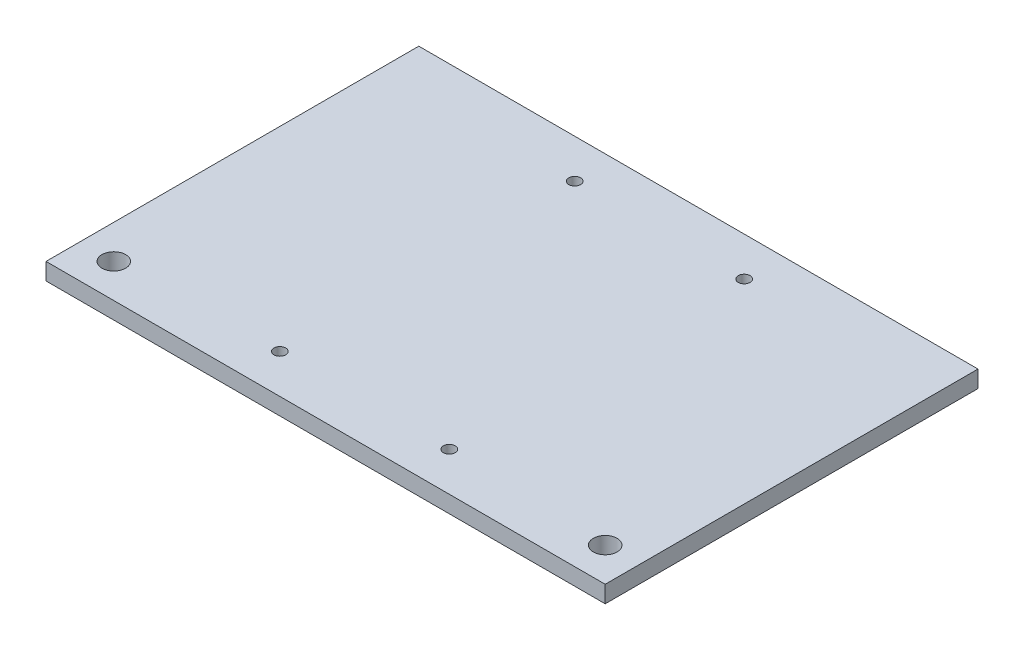
ISO-10303-21;
HEADER;
FILE_DESCRIPTION(('STEP AP214'),'2;1');
FILE_NAME('part.step','',(''),(''),'','','');
FILE_SCHEMA(('AUTOMOTIVE_DESIGN { 1 0 10303 214 1 1 1 1 }'));
ENDSEC;
DATA;
#1=APPLICATION_CONTEXT('core data for automotive mechanical design processes');
#2=APPLICATION_PROTOCOL_DEFINITION('international standard','automotive_design',2000,#1);
#3=PRODUCT_CONTEXT('',#1,'mechanical');
#4=PRODUCT('Part','Part','',(#3));
#5=PRODUCT_RELATED_PRODUCT_CATEGORY('part','',(#4));
#6=PRODUCT_DEFINITION_FORMATION('','',#4);
#7=PRODUCT_DEFINITION_CONTEXT('part definition',#1,'design');
#8=PRODUCT_DEFINITION('design','',#6,#7);
#9=PRODUCT_DEFINITION_SHAPE('','',#8);
#10=(LENGTH_UNIT() NAMED_UNIT(*) SI_UNIT(.MILLI.,.METRE.));
#11=(NAMED_UNIT(*) PLANE_ANGLE_UNIT() SI_UNIT($,.RADIAN.));
#12=(NAMED_UNIT(*) SI_UNIT($,.STERADIAN.) SOLID_ANGLE_UNIT());
#13=UNCERTAINTY_MEASURE_WITH_UNIT(LENGTH_MEASURE(1.E-05),#10,'distance_accuracy_value','');
#14=(GEOMETRIC_REPRESENTATION_CONTEXT(3) GLOBAL_UNCERTAINTY_ASSIGNED_CONTEXT((#13)) GLOBAL_UNIT_ASSIGNED_CONTEXT((#10,
#11,#12)) REPRESENTATION_CONTEXT('',''));
#15=CARTESIAN_POINT('',(0.,0.,0.));
#16=DIRECTION('',(0.,0.,1.));
#17=DIRECTION('',(1.,0.,0.));
#18=AXIS2_PLACEMENT_3D('',#15,#16,#17);
#19=CARTESIAN_POINT('',(0.,5.,0.));
#20=DIRECTION('',(0.,1.,0.));
#21=DIRECTION('',(0.,0.,1.));
#22=AXIS2_PLACEMENT_3D('',#19,#20,#21);
#23=PLANE('',#22);
#24=CARTESIAN_POINT('',(-25.,5.,-43.5));
#25=DIRECTION('',(0.,1.,0.));
#26=DIRECTION('',(0.,0.,1.));
#27=AXIS2_PLACEMENT_3D('',#24,#25,#26);
#28=CIRCLE('',#27,1.75);
#29=CARTESIAN_POINT('',(-25.,5.,-41.75));
#30=VERTEX_POINT('',#29);
#31=EDGE_CURVE('E160',#30,#30,#28,.T.);
#32=ORIENTED_EDGE('',*,*,#31,.F.);
#33=EDGE_LOOP('',(#32));
#34=FACE_BOUND('',#33,.T.);
#35=CARTESIAN_POINT('',(-25.,5.,43.5));
#36=DIRECTION('',(0.,1.,0.));
#37=DIRECTION('',(0.,0.,1.));
#38=AXIS2_PLACEMENT_3D('',#35,#36,#37);
#39=CIRCLE('',#38,1.75);
#40=CARTESIAN_POINT('',(-25.,5.,45.25));
#41=VERTEX_POINT('',#40);
#42=EDGE_CURVE('E144',#41,#41,#39,.T.);
#43=ORIENTED_EDGE('',*,*,#42,.F.);
#44=EDGE_LOOP('',(#43));
#45=FACE_BOUND('',#44,.T.);
#46=CARTESIAN_POINT('',(72.5,5.,45.));
#47=DIRECTION('',(0.,1.,0.));
#48=DIRECTION('',(0.,0.,1.));
#49=AXIS2_PLACEMENT_3D('',#46,#47,#48);
#50=CIRCLE('',#49,3.50000000000001);
#51=CARTESIAN_POINT('',(72.5,5.,48.5));
#52=VERTEX_POINT('',#51);
#53=EDGE_CURVE('E114',#52,#52,#50,.T.);
#54=ORIENTED_EDGE('',*,*,#53,.F.);
#55=EDGE_LOOP('',(#54));
#56=FACE_BOUND('',#55,.T.);
#57=DIRECTION('',(0.,0.,-1.));
#58=VECTOR('',#57,1.);
#59=CARTESIAN_POINT('',(82.5,5.,-55.));
#60=LINE('',#59,#58);
#61=CARTESIAN_POINT('',(82.5,5.,55.));
#62=VERTEX_POINT('',#61);
#63=CARTESIAN_POINT('',(82.5,5.,-55.));
#64=VERTEX_POINT('',#63);
#65=EDGE_CURVE('E94',#62,#64,#60,.T.);
#66=ORIENTED_EDGE('',*,*,#65,.T.);
#67=DIRECTION('',(-1.,0.,0.));
#68=VECTOR('',#67,1.);
#69=CARTESIAN_POINT('',(82.5,5.,-55.));
#70=LINE('',#69,#68);
#71=CARTESIAN_POINT('',(-82.5,5.,-55.));
#72=VERTEX_POINT('',#71);
#73=EDGE_CURVE('E89',#64,#72,#70,.T.);
#74=ORIENTED_EDGE('',*,*,#73,.T.);
#75=DIRECTION('',(0.,0.,1.));
#76=VECTOR('',#75,1.);
#77=CARTESIAN_POINT('',(-82.5,5.,-55.));
#78=LINE('',#77,#76);
#79=CARTESIAN_POINT('',(-82.5,5.,55.));
#80=VERTEX_POINT('',#79);
#81=EDGE_CURVE('E92',#72,#80,#78,.T.);
#82=ORIENTED_EDGE('',*,*,#81,.T.);
#83=DIRECTION('',(1.,0.,0.));
#84=VECTOR('',#83,1.);
#85=CARTESIAN_POINT('',(-82.5,5.,55.));
#86=LINE('',#85,#84);
#87=EDGE_CURVE('E59',#80,#62,#86,.T.);
#88=ORIENTED_EDGE('',*,*,#87,.T.);
#89=EDGE_LOOP('',(#66,#74,#82,#88));
#90=FACE_BOUND('',#89,.T.);
#91=CARTESIAN_POINT('',(-72.5,5.,45.));
#92=DIRECTION('',(0.,1.,0.));
#93=DIRECTION('',(0.,0.,1.));
#94=AXIS2_PLACEMENT_3D('',#91,#92,#93);
#95=CIRCLE('',#94,3.50000000000001);
#96=CARTESIAN_POINT('',(-72.5,5.,48.5));
#97=VERTEX_POINT('',#96);
#98=EDGE_CURVE('E136',#97,#97,#95,.T.);
#99=ORIENTED_EDGE('',*,*,#98,.F.);
#100=EDGE_LOOP('',(#99));
#101=FACE_BOUND('',#100,.T.);
#102=CARTESIAN_POINT('',(25.,5.,43.5));
#103=DIRECTION('',(0.,1.,0.));
#104=DIRECTION('',(0.,0.,1.));
#105=AXIS2_PLACEMENT_3D('',#102,#103,#104);
#106=CIRCLE('',#105,1.75);
#107=CARTESIAN_POINT('',(25.,5.,45.25));
#108=VERTEX_POINT('',#107);
#109=EDGE_CURVE('E152',#108,#108,#106,.T.);
#110=ORIENTED_EDGE('',*,*,#109,.F.);
#111=EDGE_LOOP('',(#110));
#112=FACE_BOUND('',#111,.T.);
#113=CARTESIAN_POINT('',(25.,5.,-43.5));
#114=DIRECTION('',(0.,1.,0.));
#115=DIRECTION('',(0.,0.,1.));
#116=AXIS2_PLACEMENT_3D('',#113,#114,#115);
#117=CIRCLE('',#116,1.75);
#118=CARTESIAN_POINT('',(25.,5.,-41.75));
#119=VERTEX_POINT('',#118);
#120=EDGE_CURVE('E168',#119,#119,#117,.T.);
#121=ORIENTED_EDGE('',*,*,#120,.F.);
#122=EDGE_LOOP('',(#121));
#123=FACE_BOUND('',#122,.T.);
#124=ADVANCED_FACE('F41',(#34,#45,#56,#90,#101,#112,#123),#23,.T.);
#125=CARTESIAN_POINT('',(0.,0.,0.));
#126=DIRECTION('',(0.,1.,0.));
#127=DIRECTION('',(0.,0.,1.));
#128=AXIS2_PLACEMENT_3D('',#125,#126,#127);
#129=PLANE('',#128);
#130=DIRECTION('',(0.,0.,-1.));
#131=VECTOR('',#130,1.);
#132=CARTESIAN_POINT('',(82.5,0.,-55.));
#133=LINE('',#132,#131);
#134=CARTESIAN_POINT('',(82.5,0.,55.));
#135=VERTEX_POINT('',#134);
#136=CARTESIAN_POINT('',(82.5,0.,-55.));
#137=VERTEX_POINT('',#136);
#138=EDGE_CURVE('E110',#135,#137,#133,.T.);
#139=ORIENTED_EDGE('',*,*,#138,.F.);
#140=DIRECTION('',(1.,0.,0.));
#141=VECTOR('',#140,1.);
#142=CARTESIAN_POINT('',(-82.5,0.,55.));
#143=LINE('',#142,#141);
#144=CARTESIAN_POINT('',(-82.5,0.,55.));
#145=VERTEX_POINT('',#144);
#146=EDGE_CURVE('E82',#145,#135,#143,.T.);
#147=ORIENTED_EDGE('',*,*,#146,.F.);
#148=DIRECTION('',(0.,0.,1.));
#149=VECTOR('',#148,1.);
#150=CARTESIAN_POINT('',(-82.5,0.,-55.));
#151=LINE('',#150,#149);
#152=CARTESIAN_POINT('',(-82.5,0.,-55.));
#153=VERTEX_POINT('',#152);
#154=EDGE_CURVE('E76',#153,#145,#151,.T.);
#155=ORIENTED_EDGE('',*,*,#154,.F.);
#156=DIRECTION('',(-1.,0.,0.));
#157=VECTOR('',#156,1.);
#158=CARTESIAN_POINT('',(82.5,0.,-55.));
#159=LINE('',#158,#157);
#160=EDGE_CURVE('E99',#137,#153,#159,.T.);
#161=ORIENTED_EDGE('',*,*,#160,.F.);
#162=EDGE_LOOP('',(#139,#147,#155,#161));
#163=FACE_BOUND('',#162,.T.);
#164=CARTESIAN_POINT('',(72.5,0.,45.));
#165=DIRECTION('',(0.,1.,0.));
#166=DIRECTION('',(0.,0.,1.));
#167=AXIS2_PLACEMENT_3D('',#164,#165,#166);
#168=CIRCLE('',#167,3.50000000000001);
#169=CARTESIAN_POINT('',(72.5,0.,48.5));
#170=VERTEX_POINT('',#169);
#171=EDGE_CURVE('E132',#170,#170,#168,.T.);
#172=ORIENTED_EDGE('',*,*,#171,.T.);
#173=EDGE_LOOP('',(#172));
#174=FACE_BOUND('',#173,.T.);
#175=CARTESIAN_POINT('',(-72.5,0.,45.));
#176=DIRECTION('',(0.,1.,0.));
#177=DIRECTION('',(0.,0.,1.));
#178=AXIS2_PLACEMENT_3D('',#175,#176,#177);
#179=CIRCLE('',#178,3.50000000000001);
#180=CARTESIAN_POINT('',(-72.5,0.,48.5));
#181=VERTEX_POINT('',#180);
#182=EDGE_CURVE('E140',#181,#181,#179,.T.);
#183=ORIENTED_EDGE('',*,*,#182,.T.);
#184=EDGE_LOOP('',(#183));
#185=FACE_BOUND('',#184,.T.);
#186=CARTESIAN_POINT('',(-25.,0.,43.5));
#187=DIRECTION('',(0.,1.,0.));
#188=DIRECTION('',(0.,0.,1.));
#189=AXIS2_PLACEMENT_3D('',#186,#187,#188);
#190=CIRCLE('',#189,1.75);
#191=CARTESIAN_POINT('',(-25.,0.,45.25));
#192=VERTEX_POINT('',#191);
#193=EDGE_CURVE('E148',#192,#192,#190,.T.);
#194=ORIENTED_EDGE('',*,*,#193,.T.);
#195=EDGE_LOOP('',(#194));
#196=FACE_BOUND('',#195,.T.);
#197=CARTESIAN_POINT('',(25.,0.,43.5));
#198=DIRECTION('',(0.,1.,0.));
#199=DIRECTION('',(0.,0.,1.));
#200=AXIS2_PLACEMENT_3D('',#197,#198,#199);
#201=CIRCLE('',#200,1.75);
#202=CARTESIAN_POINT('',(25.,0.,45.25));
#203=VERTEX_POINT('',#202);
#204=EDGE_CURVE('E156',#203,#203,#201,.T.);
#205=ORIENTED_EDGE('',*,*,#204,.T.);
#206=EDGE_LOOP('',(#205));
#207=FACE_BOUND('',#206,.T.);
#208=CARTESIAN_POINT('',(-25.,0.,-43.5));
#209=DIRECTION('',(0.,1.,0.));
#210=DIRECTION('',(0.,0.,1.));
#211=AXIS2_PLACEMENT_3D('',#208,#209,#210);
#212=CIRCLE('',#211,1.75);
#213=CARTESIAN_POINT('',(-25.,0.,-41.75));
#214=VERTEX_POINT('',#213);
#215=EDGE_CURVE('E164',#214,#214,#212,.T.);
#216=ORIENTED_EDGE('',*,*,#215,.T.);
#217=EDGE_LOOP('',(#216));
#218=FACE_BOUND('',#217,.T.);
#219=CARTESIAN_POINT('',(25.,0.,-43.5));
#220=DIRECTION('',(0.,1.,0.));
#221=DIRECTION('',(0.,0.,1.));
#222=AXIS2_PLACEMENT_3D('',#219,#220,#221);
#223=CIRCLE('',#222,1.75);
#224=CARTESIAN_POINT('',(25.,0.,-41.75));
#225=VERTEX_POINT('',#224);
#226=EDGE_CURVE('E172',#225,#225,#223,.T.);
#227=ORIENTED_EDGE('',*,*,#226,.T.);
#228=EDGE_LOOP('',(#227));
#229=FACE_BOUND('',#228,.T.);
#230=ADVANCED_FACE('F127',(#163,#174,#185,#196,#207,#218,#229),#129,.F.);
#231=CARTESIAN_POINT('',(82.5,5.,-55.));
#232=DIRECTION('',(-1.,0.,0.));
#233=DIRECTION('',(0.,0.,1.));
#234=AXIS2_PLACEMENT_3D('',#231,#232,#233);
#235=PLANE('',#234);
#236=ORIENTED_EDGE('',*,*,#138,.T.);
#237=DIRECTION('',(0.,-1.,0.));
#238=VECTOR('',#237,1.);
#239=CARTESIAN_POINT('',(82.5,5.,-55.));
#240=LINE('',#239,#238);
#241=EDGE_CURVE('E11',#64,#137,#240,.T.);
#242=ORIENTED_EDGE('',*,*,#241,.F.);
#243=ORIENTED_EDGE('',*,*,#65,.F.);
#244=DIRECTION('',(0.,-1.,0.));
#245=VECTOR('',#244,1.);
#246=CARTESIAN_POINT('',(82.5,5.,55.));
#247=LINE('',#246,#245);
#248=EDGE_CURVE('E106',#62,#135,#247,.T.);
#249=ORIENTED_EDGE('',*,*,#248,.T.);
#250=EDGE_LOOP('',(#236,#242,#243,#249));
#251=FACE_BOUND('',#250,.T.);
#252=ADVANCED_FACE('F43',(#251),#235,.F.);
#253=CARTESIAN_POINT('',(82.5,5.,-55.));
#254=DIRECTION('',(0.,0.,1.));
#255=DIRECTION('',(1.,0.,0.));
#256=AXIS2_PLACEMENT_3D('',#253,#254,#255);
#257=PLANE('',#256);
#258=ORIENTED_EDGE('',*,*,#160,.T.);
#259=DIRECTION('',(0.,-1.,0.));
#260=VECTOR('',#259,1.);
#261=CARTESIAN_POINT('',(-82.5,5.,-55.));
#262=LINE('',#261,#260);
#263=EDGE_CURVE('E51',#72,#153,#262,.T.);
#264=ORIENTED_EDGE('',*,*,#263,.F.);
#265=ORIENTED_EDGE('',*,*,#73,.F.);
#266=ORIENTED_EDGE('',*,*,#241,.T.);
#267=EDGE_LOOP('',(#258,#264,#265,#266));
#268=FACE_BOUND('',#267,.T.);
#269=ADVANCED_FACE('F98',(#268),#257,.F.);
#270=CARTESIAN_POINT('',(-82.5,5.,-55.));
#271=DIRECTION('',(1.,0.,0.));
#272=DIRECTION('',(0.,0.,-1.));
#273=AXIS2_PLACEMENT_3D('',#270,#271,#272);
#274=PLANE('',#273);
#275=ORIENTED_EDGE('',*,*,#154,.T.);
#276=DIRECTION('',(0.,-1.,0.));
#277=VECTOR('',#276,1.);
#278=CARTESIAN_POINT('',(-82.5,5.,55.));
#279=LINE('',#278,#277);
#280=EDGE_CURVE('E101',#80,#145,#279,.T.);
#281=ORIENTED_EDGE('',*,*,#280,.F.);
#282=ORIENTED_EDGE('',*,*,#81,.F.);
#283=ORIENTED_EDGE('',*,*,#263,.T.);
#284=EDGE_LOOP('',(#275,#281,#282,#283));
#285=FACE_BOUND('',#284,.T.);
#286=ADVANCED_FACE('F102',(#285),#274,.F.);
#287=CARTESIAN_POINT('',(-82.5,5.,55.));
#288=DIRECTION('',(0.,0.,-1.));
#289=DIRECTION('',(-1.,0.,0.));
#290=AXIS2_PLACEMENT_3D('',#287,#288,#289);
#291=PLANE('',#290);
#292=ORIENTED_EDGE('',*,*,#146,.T.);
#293=ORIENTED_EDGE('',*,*,#248,.F.);
#294=ORIENTED_EDGE('',*,*,#87,.F.);
#295=ORIENTED_EDGE('',*,*,#280,.T.);
#296=EDGE_LOOP('',(#292,#293,#294,#295));
#297=FACE_BOUND('',#296,.T.);
#298=ADVANCED_FACE('F124',(#297),#291,.F.);
#299=CARTESIAN_POINT('',(72.5,5.,45.));
#300=DIRECTION('',(0.,-1.,0.));
#301=DIRECTION('',(0.,0.,-1.));
#302=AXIS2_PLACEMENT_3D('',#299,#300,#301);
#303=CYLINDRICAL_SURFACE('',#302,3.50000000000001);
#304=ORIENTED_EDGE('',*,*,#53,.T.);
#305=EDGE_LOOP('',(#304));
#306=FACE_BOUND('',#305,.T.);
#307=ORIENTED_EDGE('',*,*,#171,.F.);
#308=EDGE_LOOP('',(#307));
#309=FACE_BOUND('',#308,.T.);
#310=ADVANCED_FACE('F193',(#306,#309),#303,.F.);
#311=CARTESIAN_POINT('',(-72.5,5.,45.));
#312=DIRECTION('',(0.,-1.,0.));
#313=DIRECTION('',(0.,0.,-1.));
#314=AXIS2_PLACEMENT_3D('',#311,#312,#313);
#315=CYLINDRICAL_SURFACE('',#314,3.50000000000001);
#316=ORIENTED_EDGE('',*,*,#98,.T.);
#317=EDGE_LOOP('',(#316));
#318=FACE_BOUND('',#317,.T.);
#319=ORIENTED_EDGE('',*,*,#182,.F.);
#320=EDGE_LOOP('',(#319));
#321=FACE_BOUND('',#320,.T.);
#322=ADVANCED_FACE('F239',(#318,#321),#315,.F.);
#323=CARTESIAN_POINT('',(-25.,5.,43.5));
#324=DIRECTION('',(0.,-1.,0.));
#325=DIRECTION('',(0.,0.,-1.));
#326=AXIS2_PLACEMENT_3D('',#323,#324,#325);
#327=CYLINDRICAL_SURFACE('',#326,1.75);
#328=ORIENTED_EDGE('',*,*,#42,.T.);
#329=EDGE_LOOP('',(#328));
#330=FACE_BOUND('',#329,.T.);
#331=ORIENTED_EDGE('',*,*,#193,.F.);
#332=EDGE_LOOP('',(#331));
#333=FACE_BOUND('',#332,.T.);
#334=ADVANCED_FACE('F247',(#330,#333),#327,.F.);
#335=CARTESIAN_POINT('',(25.,5.,43.5));
#336=DIRECTION('',(0.,-1.,0.));
#337=DIRECTION('',(0.,0.,-1.));
#338=AXIS2_PLACEMENT_3D('',#335,#336,#337);
#339=CYLINDRICAL_SURFACE('',#338,1.75);
#340=ORIENTED_EDGE('',*,*,#109,.T.);
#341=EDGE_LOOP('',(#340));
#342=FACE_BOUND('',#341,.T.);
#343=ORIENTED_EDGE('',*,*,#204,.F.);
#344=EDGE_LOOP('',(#343));
#345=FACE_BOUND('',#344,.T.);
#346=ADVANCED_FACE('F255',(#342,#345),#339,.F.);
#347=CARTESIAN_POINT('',(-25.,5.,-43.5));
#348=DIRECTION('',(0.,-1.,0.));
#349=DIRECTION('',(0.,0.,-1.));
#350=AXIS2_PLACEMENT_3D('',#347,#348,#349);
#351=CYLINDRICAL_SURFACE('',#350,1.75);
#352=ORIENTED_EDGE('',*,*,#31,.T.);
#353=EDGE_LOOP('',(#352));
#354=FACE_BOUND('',#353,.T.);
#355=ORIENTED_EDGE('',*,*,#215,.F.);
#356=EDGE_LOOP('',(#355));
#357=FACE_BOUND('',#356,.T.);
#358=ADVANCED_FACE('F264',(#354,#357),#351,.F.);
#359=CARTESIAN_POINT('',(25.,5.,-43.5));
#360=DIRECTION('',(0.,-1.,0.));
#361=DIRECTION('',(0.,0.,-1.));
#362=AXIS2_PLACEMENT_3D('',#359,#360,#361);
#363=CYLINDRICAL_SURFACE('',#362,1.75);
#364=ORIENTED_EDGE('',*,*,#120,.T.);
#365=EDGE_LOOP('',(#364));
#366=FACE_BOUND('',#365,.T.);
#367=ORIENTED_EDGE('',*,*,#226,.F.);
#368=EDGE_LOOP('',(#367));
#369=FACE_BOUND('',#368,.T.);
#370=ADVANCED_FACE('F180',(#366,#369),#363,.F.);
#371=CLOSED_SHELL('',(#124,#230,#252,#269,#286,#298,#310,#322,#334,#346,#358,#370));
#372=MANIFOLD_SOLID_BREP('B2',#371);
#373=ADVANCED_BREP_SHAPE_REPRESENTATION('',(#18,#372),#14);
#374=SHAPE_DEFINITION_REPRESENTATION(#9,#373);
ENDSEC;
END-ISO-10303-21;
